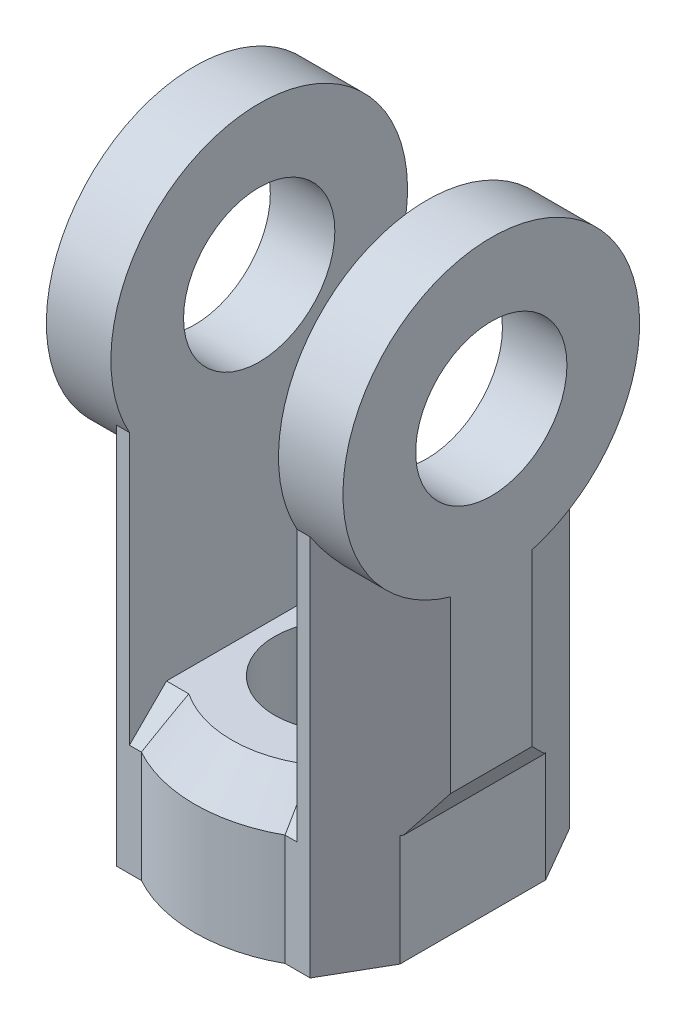
ISO-10303-21;
HEADER;
FILE_DESCRIPTION(('STEP AP214'),'2;1');
FILE_NAME('part.step','',(''),(''),'','','');
FILE_SCHEMA(('AUTOMOTIVE_DESIGN { 1 0 10303 214 1 1 1 1 }'));
ENDSEC;
DATA;
#1=APPLICATION_CONTEXT('core data for automotive mechanical design processes');
#2=APPLICATION_PROTOCOL_DEFINITION('international standard','automotive_design',2000,#1);
#3=PRODUCT_CONTEXT('',#1,'mechanical');
#4=PRODUCT('Part','Part','',(#3));
#5=PRODUCT_RELATED_PRODUCT_CATEGORY('part','',(#4));
#6=PRODUCT_DEFINITION_FORMATION('','',#4);
#7=PRODUCT_DEFINITION_CONTEXT('part definition',#1,'design');
#8=PRODUCT_DEFINITION('design','',#6,#7);
#9=PRODUCT_DEFINITION_SHAPE('','',#8);
#10=(LENGTH_UNIT() NAMED_UNIT(*) SI_UNIT(.MILLI.,.METRE.));
#11=(NAMED_UNIT(*) PLANE_ANGLE_UNIT() SI_UNIT($,.RADIAN.));
#12=(NAMED_UNIT(*) SI_UNIT($,.STERADIAN.) SOLID_ANGLE_UNIT());
#13=UNCERTAINTY_MEASURE_WITH_UNIT(LENGTH_MEASURE(1.E-05),#10,'distance_accuracy_value','');
#14=(GEOMETRIC_REPRESENTATION_CONTEXT(3) GLOBAL_UNCERTAINTY_ASSIGNED_CONTEXT((#13)) GLOBAL_UNIT_ASSIGNED_CONTEXT((#10,
#11,#12)) REPRESENTATION_CONTEXT('',''));
#15=CARTESIAN_POINT('',(0.,0.,0.));
#16=DIRECTION('',(0.,0.,1.));
#17=DIRECTION('',(1.,0.,0.));
#18=AXIS2_PLACEMENT_3D('',#15,#16,#17);
#19=CARTESIAN_POINT('',(-12.2967221242085,25.4,-22.225));
#20=DIRECTION('',(0.,0.,1.));
#21=DIRECTION('',(1.,0.,0.));
#22=AXIS2_PLACEMENT_3D('',#19,#20,#21);
#23=PLANE('',#22);
#24=DIRECTION('',(-1.,0.,0.));
#25=VECTOR('',#24,1.);
#26=CARTESIAN_POINT('',(57.4910489685532,65.4272778757914,-22.225));
#27=LINE('',#26,#25);
#28=CARTESIAN_POINT('',(-14.351,65.4272778757915,-22.225));
#29=VERTEX_POINT('',#28);
#30=CARTESIAN_POINT('',(-16.6011818975501,65.4272778757915,-22.225));
#31=VERTEX_POINT('',#30);
#32=EDGE_CURVE('E210',#29,#31,#27,.T.);
#33=ORIENTED_EDGE('',*,*,#32,.F.);
#34=DIRECTION('',(0.,-1.,0.));
#35=VECTOR('',#34,1.);
#36=CARTESIAN_POINT('',(-14.351,77.724,-22.225));
#37=LINE('',#36,#35);
#38=CARTESIAN_POINT('',(-14.351,19.0499999999999,-22.225));
#39=VERTEX_POINT('',#38);
#40=EDGE_CURVE('E221',#29,#39,#37,.T.);
#41=ORIENTED_EDGE('',*,*,#40,.T.);
#42=DIRECTION('',(1.,0.,0.));
#43=VECTOR('',#42,1.);
#44=CARTESIAN_POINT('',(-12.2967221242085,19.0499999999999,-22.225));
#45=LINE('',#44,#43);
#46=CARTESIAN_POINT('',(-12.2967221242085,19.0499999999999,-22.225));
#47=VERTEX_POINT('',#46);
#48=EDGE_CURVE('E280',#39,#47,#45,.T.);
#49=ORIENTED_EDGE('',*,*,#48,.T.);
#50=DIRECTION('',(0.,-1.,0.));
#51=VECTOR('',#50,1.);
#52=CARTESIAN_POINT('',(-12.2967221242085,25.4,-22.225));
#53=LINE('',#52,#51);
#54=CARTESIAN_POINT('',(-12.2967221242085,0.,-22.225));
#55=VERTEX_POINT('',#54);
#56=EDGE_CURVE('E264',#47,#55,#53,.T.);
#57=ORIENTED_EDGE('',*,*,#56,.T.);
#58=DIRECTION('',(-1.,0.,0.));
#59=VECTOR('',#58,1.);
#60=CARTESIAN_POINT('',(-12.2967221242085,0.,-22.225));
#61=LINE('',#60,#59);
#62=CARTESIAN_POINT('',(-16.6011818975501,0.,-22.225));
#63=VERTEX_POINT('',#62);
#64=EDGE_CURVE('E244',#55,#63,#61,.T.);
#65=ORIENTED_EDGE('',*,*,#64,.T.);
#66=DIRECTION('',(0.,1.,0.));
#67=VECTOR('',#66,1.);
#68=CARTESIAN_POINT('',(-16.6011818975501,25.4,-22.225));
#69=LINE('',#68,#67);
#70=EDGE_CURVE('E225',#63,#31,#69,.T.);
#71=ORIENTED_EDGE('',*,*,#70,.T.);
#72=EDGE_LOOP('',(#33,#41,#49,#57,#65,#71));
#73=FACE_BOUND('',#72,.T.);
#74=ADVANCED_FACE('F36',(#73),#23,.F.);
#75=CARTESIAN_POINT('',(-25.4,25.4,22.225));
#76=DIRECTION('',(0.,0.,-1.));
#77=DIRECTION('',(-1.,0.,0.));
#78=AXIS2_PLACEMENT_3D('',#75,#76,#77);
#79=PLANE('',#78);
#80=DIRECTION('',(-1.,0.,0.));
#81=VECTOR('',#80,1.);
#82=CARTESIAN_POINT('',(57.4910489685532,65.4272778757914,22.225));
#83=LINE('',#82,#81);
#84=CARTESIAN_POINT('',(-16.6011818975501,65.4272778757914,22.225));
#85=VERTEX_POINT('',#84);
#86=CARTESIAN_POINT('',(-14.351,65.4272778757914,22.225));
#87=VERTEX_POINT('',#86);
#88=EDGE_CURVE('E213',#85,#87,#83,.F.);
#89=ORIENTED_EDGE('',*,*,#88,.F.);
#90=DIRECTION('',(0.,-1.,0.));
#91=VECTOR('',#90,1.);
#92=CARTESIAN_POINT('',(-16.6011818975501,25.4,22.225));
#93=LINE('',#92,#91);
#94=CARTESIAN_POINT('',(-16.6011818975501,0.,22.225));
#95=VERTEX_POINT('',#94);
#96=EDGE_CURVE('E469',#85,#95,#93,.T.);
#97=ORIENTED_EDGE('',*,*,#96,.T.);
#98=DIRECTION('',(1.,0.,0.));
#99=VECTOR('',#98,1.);
#100=CARTESIAN_POINT('',(-25.4,0.,22.225));
#101=LINE('',#100,#99);
#102=CARTESIAN_POINT('',(-12.2967221242085,0.,22.225));
#103=VERTEX_POINT('',#102);
#104=EDGE_CURVE('E246',#95,#103,#101,.T.);
#105=ORIENTED_EDGE('',*,*,#104,.T.);
#106=DIRECTION('',(0.,-1.,0.));
#107=VECTOR('',#106,1.);
#108=CARTESIAN_POINT('',(-12.2967221242085,25.4,22.225));
#109=LINE('',#108,#107);
#110=CARTESIAN_POINT('',(-12.2967221242085,19.0499999999999,22.225));
#111=VERTEX_POINT('',#110);
#112=EDGE_CURVE('E261',#111,#103,#109,.T.);
#113=ORIENTED_EDGE('',*,*,#112,.F.);
#114=DIRECTION('',(-1.,0.,0.));
#115=VECTOR('',#114,1.);
#116=CARTESIAN_POINT('',(-14.351,19.0499999999999,22.225));
#117=LINE('',#116,#115);
#118=CARTESIAN_POINT('',(-14.351,19.0499999999999,22.225));
#119=VERTEX_POINT('',#118);
#120=EDGE_CURVE('E289',#111,#119,#117,.T.);
#121=ORIENTED_EDGE('',*,*,#120,.T.);
#122=DIRECTION('',(0.,-1.,0.));
#123=VECTOR('',#122,1.);
#124=CARTESIAN_POINT('',(-14.351,77.724,22.225));
#125=LINE('',#124,#123);
#126=EDGE_CURVE('E233',#87,#119,#125,.T.);
#127=ORIENTED_EDGE('',*,*,#126,.F.);
#128=EDGE_LOOP('',(#89,#97,#105,#113,#121,#127));
#129=FACE_BOUND('',#128,.T.);
#130=ADVANCED_FACE('F392',(#129),#79,.F.);
#131=CARTESIAN_POINT('',(25.4,25.4,-22.225));
#132=DIRECTION('',(-1.,0.,0.));
#133=DIRECTION('',(0.,0.,1.));
#134=AXIS2_PLACEMENT_3D('',#131,#132,#133);
#135=PLANE('',#134);
#136=CARTESIAN_POINT('',(25.4,77.724,0.));
#137=DIRECTION('',(1.,0.,0.));
#138=DIRECTION('',(0.,0.,-1.));
#139=AXIS2_PLACEMENT_3D('',#136,#137,#138);
#140=CIRCLE('',#139,12.954);
#141=CARTESIAN_POINT('',(25.4,77.724,-12.954));
#142=VERTEX_POINT('',#141);
#143=EDGE_CURVE('E597',#142,#142,#140,.T.);
#144=ORIENTED_EDGE('',*,*,#143,.F.);
#145=EDGE_LOOP('',(#144));
#146=FACE_BOUND('',#145,.T.);
#147=DIRECTION('',(0.,-1.,0.));
#148=VECTOR('',#147,1.);
#149=CARTESIAN_POINT('',(25.4,25.4,6.98499999999993));
#150=LINE('',#149,#148);
#151=CARTESIAN_POINT('',(25.4,53.3033166557526,6.98499999999993));
#152=VERTEX_POINT('',#151);
#153=CARTESIAN_POINT('',(25.4,24.13,6.98499999999993));
#154=VERTEX_POINT('',#153);
#155=EDGE_CURVE('E621',#152,#154,#150,.T.);
#156=ORIENTED_EDGE('',*,*,#155,.T.);
#157=DIRECTION('',(0.,0.,-1.));
#158=VECTOR('',#157,1.);
#159=CARTESIAN_POINT('',(25.4,24.13,-6.98499999999991));
#160=LINE('',#159,#158);
#161=CARTESIAN_POINT('',(25.4,24.13,-6.98499999999991));
#162=VERTEX_POINT('',#161);
#163=EDGE_CURVE('E44',#154,#162,#160,.T.);
#164=ORIENTED_EDGE('',*,*,#163,.T.);
#165=DIRECTION('',(0.,1.,0.));
#166=VECTOR('',#165,1.);
#167=CARTESIAN_POINT('',(25.4,25.4,-6.98499999999991));
#168=LINE('',#167,#166);
#169=CARTESIAN_POINT('',(25.4,53.3033166557526,-6.98499999999991));
#170=VERTEX_POINT('',#169);
#171=EDGE_CURVE('E302',#162,#170,#168,.T.);
#172=ORIENTED_EDGE('',*,*,#171,.T.);
#173=CARTESIAN_POINT('',(25.4,77.724,0.));
#174=DIRECTION('',(1.,0.,0.));
#175=DIRECTION('',(0.,0.,-1.));
#176=AXIS2_PLACEMENT_3D('',#173,#174,#175);
#177=CIRCLE('',#176,25.4);
#178=EDGE_CURVE('E226',#170,#152,#177,.T.);
#179=ORIENTED_EDGE('',*,*,#178,.T.);
#180=EDGE_LOOP('',(#156,#164,#172,#179));
#181=FACE_BOUND('',#180,.T.);
#182=ADVANCED_FACE('F397',(#146,#181),#135,.F.);
#183=CARTESIAN_POINT('',(0.,25.4,0.));
#184=DIRECTION('',(0.,1.,0.));
#185=DIRECTION('',(0.,0.,1.));
#186=AXIS2_PLACEMENT_3D('',#183,#184,#185);
#187=PLANE('',#186);
#188=CARTESIAN_POINT('',(0.,25.4,0.));
#189=DIRECTION('',(0.,1.,0.));
#190=DIRECTION('',(0.,0.,1.));
#191=AXIS2_PLACEMENT_3D('',#188,#189,#190);
#192=CIRCLE('',#191,11.70813);
#193=CARTESIAN_POINT('',(0.,25.4,11.70813));
#194=VERTEX_POINT('',#193);
#195=EDGE_CURVE('E350',#194,#194,#192,.T.);
#196=ORIENTED_EDGE('',*,*,#195,.F.);
#197=EDGE_LOOP('',(#196));
#198=FACE_BOUND('',#197,.T.);
#199=CARTESIAN_POINT('',(0.,25.4,0.));
#200=DIRECTION('',(0.,1.,0.));
#201=DIRECTION('',(0.,0.,1.));
#202=AXIS2_PLACEMENT_3D('',#199,#200,#201);
#203=CIRCLE('',#202,19.05);
#204=CARTESIAN_POINT('',(10.5302837093784,25.4,-15.875));
#205=VERTEX_POINT('',#204);
#206=CARTESIAN_POINT('',(-10.5302837093784,25.4,-15.875));
#207=VERTEX_POINT('',#206);
#208=EDGE_CURVE('E273',#205,#207,#203,.T.);
#209=ORIENTED_EDGE('',*,*,#208,.T.);
#210=DIRECTION('',(-1.,0.,0.));
#211=VECTOR('',#210,1.);
#212=CARTESIAN_POINT('',(-14.351,25.4,-15.875));
#213=LINE('',#212,#211);
#214=CARTESIAN_POINT('',(-14.351,25.4,-15.875));
#215=VERTEX_POINT('',#214);
#216=EDGE_CURVE('E277',#207,#215,#213,.T.);
#217=ORIENTED_EDGE('',*,*,#216,.T.);
#218=DIRECTION('',(0.,0.,-1.));
#219=VECTOR('',#218,1.);
#220=CARTESIAN_POINT('',(-14.351,25.4,-22.225));
#221=LINE('',#220,#219);
#222=CARTESIAN_POINT('',(-14.351,25.4,15.875));
#223=VERTEX_POINT('',#222);
#224=EDGE_CURVE('E234',#223,#215,#221,.T.);
#225=ORIENTED_EDGE('',*,*,#224,.F.);
#226=DIRECTION('',(1.,0.,0.));
#227=VECTOR('',#226,1.);
#228=CARTESIAN_POINT('',(-12.2967221242085,25.4,15.875));
#229=LINE('',#228,#227);
#230=CARTESIAN_POINT('',(-10.5302837093784,25.4,15.875));
#231=VERTEX_POINT('',#230);
#232=EDGE_CURVE('E268',#223,#231,#229,.T.);
#233=ORIENTED_EDGE('',*,*,#232,.T.);
#234=CARTESIAN_POINT('',(0.,25.4,0.));
#235=DIRECTION('',(0.,1.,0.));
#236=DIRECTION('',(0.,0.,1.));
#237=AXIS2_PLACEMENT_3D('',#234,#235,#236);
#238=CIRCLE('',#237,19.05);
#239=CARTESIAN_POINT('',(10.5302837093784,25.4,15.875));
#240=VERTEX_POINT('',#239);
#241=EDGE_CURVE('E266',#231,#240,#238,.T.);
#242=ORIENTED_EDGE('',*,*,#241,.T.);
#243=DIRECTION('',(1.,0.,0.));
#244=VECTOR('',#243,1.);
#245=CARTESIAN_POINT('',(14.351,25.4,15.875));
#246=LINE('',#245,#244);
#247=CARTESIAN_POINT('',(14.351,25.4,15.875));
#248=VERTEX_POINT('',#247);
#249=EDGE_CURVE('E270',#240,#248,#246,.T.);
#250=ORIENTED_EDGE('',*,*,#249,.T.);
#251=DIRECTION('',(0.,0.,1.));
#252=VECTOR('',#251,1.);
#253=CARTESIAN_POINT('',(14.351,25.4,22.225));
#254=LINE('',#253,#252);
#255=CARTESIAN_POINT('',(14.351,25.4,-15.875));
#256=VERTEX_POINT('',#255);
#257=EDGE_CURVE('E443',#256,#248,#254,.T.);
#258=ORIENTED_EDGE('',*,*,#257,.F.);
#259=DIRECTION('',(-1.,0.,0.));
#260=VECTOR('',#259,1.);
#261=CARTESIAN_POINT('',(12.2967221242085,25.4,-15.875));
#262=LINE('',#261,#260);
#263=EDGE_CURVE('E275',#256,#205,#262,.T.);
#264=ORIENTED_EDGE('',*,*,#263,.T.);
#265=EDGE_LOOP('',(#209,#217,#225,#233,#242,#250,#258,#264));
#266=FACE_BOUND('',#265,.T.);
#267=ADVANCED_FACE('F404',(#198,#266),#187,.T.);
#268=CARTESIAN_POINT('',(0.,25.4,0.));
#269=DIRECTION('',(0.,-1.,0.));
#270=DIRECTION('',(0.,0.,-1.));
#271=AXIS2_PLACEMENT_3D('',#268,#269,#270);
#272=CYLINDRICAL_SURFACE('',#271,25.4);
#273=ORIENTED_EDGE('',*,*,#56,.F.);
#274=CARTESIAN_POINT('',(0.,19.0499999999999,0.));
#275=DIRECTION('',(0.,1.,0.));
#276=DIRECTION('',(0.,0.,1.));
#277=AXIS2_PLACEMENT_3D('',#274,#275,#276);
#278=CIRCLE('',#277,25.4);
#279=CARTESIAN_POINT('',(12.2967221242085,19.0499999999999,-22.225));
#280=VERTEX_POINT('',#279);
#281=EDGE_CURVE('E285',#47,#280,#278,.F.);
#282=ORIENTED_EDGE('',*,*,#281,.T.);
#283=DIRECTION('',(0.,-1.,0.));
#284=VECTOR('',#283,1.);
#285=CARTESIAN_POINT('',(12.2967221242085,25.4,-22.225));
#286=LINE('',#285,#284);
#287=CARTESIAN_POINT('',(12.2967221242085,0.,-22.225));
#288=VERTEX_POINT('',#287);
#289=EDGE_CURVE('E256',#280,#288,#286,.T.);
#290=ORIENTED_EDGE('',*,*,#289,.T.);
#291=CARTESIAN_POINT('',(0.,0.,0.));
#292=DIRECTION('',(0.,1.,0.));
#293=DIRECTION('',(0.,0.,1.));
#294=AXIS2_PLACEMENT_3D('',#291,#292,#293);
#295=CIRCLE('',#294,25.4);
#296=EDGE_CURVE('E236',#288,#55,#295,.T.);
#297=ORIENTED_EDGE('',*,*,#296,.T.);
#298=EDGE_LOOP('',(#273,#282,#290,#297));
#299=FACE_BOUND('',#298,.T.);
#300=ADVANCED_FACE('F402',(#299),#272,.T.);
#301=CARTESIAN_POINT('',(-25.4,25.4,-22.225));
#302=DIRECTION('',(1.,0.,0.));
#303=DIRECTION('',(0.,0.,-1.));
#304=AXIS2_PLACEMENT_3D('',#301,#302,#303);
#305=PLANE('',#304);
#306=CARTESIAN_POINT('',(-25.4,77.724,0.));
#307=DIRECTION('',(1.,0.,0.));
#308=DIRECTION('',(0.,0.,-1.));
#309=AXIS2_PLACEMENT_3D('',#306,#307,#308);
#310=CIRCLE('',#309,12.954);
#311=CARTESIAN_POINT('',(-25.4,77.724,-12.954));
#312=VERTEX_POINT('',#311);
#313=EDGE_CURVE('E498',#312,#312,#310,.T.);
#314=ORIENTED_EDGE('',*,*,#313,.T.);
#315=EDGE_LOOP('',(#314));
#316=FACE_BOUND('',#315,.T.);
#317=DIRECTION('',(0.,-1.,0.));
#318=VECTOR('',#317,1.);
#319=CARTESIAN_POINT('',(-25.4,25.4,-6.98499999999992));
#320=LINE('',#319,#318);
#321=CARTESIAN_POINT('',(-25.4,53.3033166557526,-6.98499999999989));
#322=VERTEX_POINT('',#321);
#323=CARTESIAN_POINT('',(-25.4,24.13,-6.98499999999992));
#324=VERTEX_POINT('',#323);
#325=EDGE_CURVE('E467',#322,#324,#320,.T.);
#326=ORIENTED_EDGE('',*,*,#325,.T.);
#327=DIRECTION('',(0.,0.,1.));
#328=VECTOR('',#327,1.);
#329=CARTESIAN_POINT('',(-25.4,24.13,-22.225));
#330=LINE('',#329,#328);
#331=CARTESIAN_POINT('',(-25.4,24.13,6.98499999999992));
#332=VERTEX_POINT('',#331);
#333=EDGE_CURVE('E493',#324,#332,#330,.T.);
#334=ORIENTED_EDGE('',*,*,#333,.T.);
#335=DIRECTION('',(0.,1.,0.));
#336=VECTOR('',#335,1.);
#337=CARTESIAN_POINT('',(-25.4,25.4,6.98499999999992));
#338=LINE('',#337,#336);
#339=CARTESIAN_POINT('',(-25.4,53.3033166557526,6.98499999999992));
#340=VERTEX_POINT('',#339);
#341=EDGE_CURVE('E472',#332,#340,#338,.T.);
#342=ORIENTED_EDGE('',*,*,#341,.T.);
#343=CARTESIAN_POINT('',(-25.4,77.724,0.));
#344=DIRECTION('',(1.,0.,0.));
#345=DIRECTION('',(0.,0.,-1.));
#346=AXIS2_PLACEMENT_3D('',#343,#344,#345);
#347=CIRCLE('',#346,25.4);
#348=EDGE_CURVE('E217',#322,#340,#347,.T.);
#349=ORIENTED_EDGE('',*,*,#348,.F.);
#350=EDGE_LOOP('',(#326,#334,#342,#349));
#351=FACE_BOUND('',#350,.T.);
#352=ADVANCED_FACE('F401',(#316,#351),#305,.F.);
#353=CARTESIAN_POINT('',(0.,25.4,0.));
#354=DIRECTION('',(0.,-1.,0.));
#355=DIRECTION('',(0.,0.,-1.));
#356=AXIS2_PLACEMENT_3D('',#353,#354,#355);
#357=CYLINDRICAL_SURFACE('',#356,25.4);
#358=DIRECTION('',(0.,-1.,0.));
#359=VECTOR('',#358,1.);
#360=CARTESIAN_POINT('',(12.2967221242085,25.4,22.225));
#361=LINE('',#360,#359);
#362=CARTESIAN_POINT('',(12.2967221242085,19.0499999999999,22.225));
#363=VERTEX_POINT('',#362);
#364=CARTESIAN_POINT('',(12.2967221242085,0.,22.225));
#365=VERTEX_POINT('',#364);
#366=EDGE_CURVE('E259',#363,#365,#361,.T.);
#367=ORIENTED_EDGE('',*,*,#366,.F.);
#368=CARTESIAN_POINT('',(0.,19.0499999999999,0.));
#369=DIRECTION('',(0.,1.,0.));
#370=DIRECTION('',(0.,0.,1.));
#371=AXIS2_PLACEMENT_3D('',#368,#369,#370);
#372=CIRCLE('',#371,25.4);
#373=EDGE_CURVE('E292',#363,#111,#372,.F.);
#374=ORIENTED_EDGE('',*,*,#373,.T.);
#375=ORIENTED_EDGE('',*,*,#112,.T.);
#376=CARTESIAN_POINT('',(0.,0.,0.));
#377=DIRECTION('',(0.,1.,0.));
#378=DIRECTION('',(0.,0.,1.));
#379=AXIS2_PLACEMENT_3D('',#376,#377,#378);
#380=CIRCLE('',#379,25.4);
#381=EDGE_CURVE('E248',#103,#365,#380,.T.);
#382=ORIENTED_EDGE('',*,*,#381,.T.);
#383=EDGE_LOOP('',(#367,#374,#375,#382));
#384=FACE_BOUND('',#383,.T.);
#385=ADVANCED_FACE('F410',(#384),#357,.T.);
#386=CARTESIAN_POINT('',(25.4,25.4,22.225));
#387=DIRECTION('',(0.,0.,-1.));
#388=DIRECTION('',(-1.,0.,0.));
#389=AXIS2_PLACEMENT_3D('',#386,#387,#388);
#390=PLANE('',#389);
#391=DIRECTION('',(0.,1.,0.));
#392=VECTOR('',#391,1.);
#393=CARTESIAN_POINT('',(16.6011818975501,25.4,22.225));
#394=LINE('',#393,#392);
#395=CARTESIAN_POINT('',(16.6011818975501,0.,22.225));
#396=VERTEX_POINT('',#395);
#397=CARTESIAN_POINT('',(16.6011818975501,65.4272778757914,22.225));
#398=VERTEX_POINT('',#397);
#399=EDGE_CURVE('E579',#396,#398,#394,.T.);
#400=ORIENTED_EDGE('',*,*,#399,.T.);
#401=DIRECTION('',(1.,0.,0.));
#402=VECTOR('',#401,1.);
#403=CARTESIAN_POINT('',(-57.4910489685532,65.4272778757915,22.225));
#404=LINE('',#403,#402);
#405=CARTESIAN_POINT('',(14.351,65.4272778757914,22.225));
#406=VERTEX_POINT('',#405);
#407=EDGE_CURVE('E578',#398,#406,#404,.F.);
#408=ORIENTED_EDGE('',*,*,#407,.T.);
#409=DIRECTION('',(0.,-1.,0.));
#410=VECTOR('',#409,1.);
#411=CARTESIAN_POINT('',(14.351,77.724,22.225));
#412=LINE('',#411,#410);
#413=CARTESIAN_POINT('',(14.351,19.0499999999999,22.225));
#414=VERTEX_POINT('',#413);
#415=EDGE_CURVE('E442',#406,#414,#412,.T.);
#416=ORIENTED_EDGE('',*,*,#415,.T.);
#417=DIRECTION('',(-1.,0.,0.));
#418=VECTOR('',#417,1.);
#419=CARTESIAN_POINT('',(12.2967221242085,19.0499999999999,22.225));
#420=LINE('',#419,#418);
#421=EDGE_CURVE('E287',#414,#363,#420,.T.);
#422=ORIENTED_EDGE('',*,*,#421,.T.);
#423=ORIENTED_EDGE('',*,*,#366,.T.);
#424=DIRECTION('',(1.,0.,0.));
#425=VECTOR('',#424,1.);
#426=CARTESIAN_POINT('',(25.4,0.,22.225));
#427=LINE('',#426,#425);
#428=EDGE_CURVE('E251',#365,#396,#427,.T.);
#429=ORIENTED_EDGE('',*,*,#428,.T.);
#430=EDGE_LOOP('',(#400,#408,#416,#422,#423,#429));
#431=FACE_BOUND('',#430,.T.);
#432=ADVANCED_FACE('F560',(#431),#390,.F.);
#433=CARTESIAN_POINT('',(12.2967221242085,25.4,-22.225));
#434=DIRECTION('',(0.,0.,1.));
#435=DIRECTION('',(1.,0.,0.));
#436=AXIS2_PLACEMENT_3D('',#433,#434,#435);
#437=PLANE('',#436);
#438=DIRECTION('',(0.,-1.,0.));
#439=VECTOR('',#438,1.);
#440=CARTESIAN_POINT('',(14.351,77.724,-22.225));
#441=LINE('',#440,#439);
#442=CARTESIAN_POINT('',(14.351,65.4272778757915,-22.225));
#443=VERTEX_POINT('',#442);
#444=CARTESIAN_POINT('',(14.351,19.0499999999999,-22.225));
#445=VERTEX_POINT('',#444);
#446=EDGE_CURVE('E238',#443,#445,#441,.T.);
#447=ORIENTED_EDGE('',*,*,#446,.F.);
#448=DIRECTION('',(1.,0.,0.));
#449=VECTOR('',#448,1.);
#450=CARTESIAN_POINT('',(-57.4910489685532,65.4272778757914,-22.225));
#451=LINE('',#450,#449);
#452=CARTESIAN_POINT('',(16.6011818975501,65.4272778757915,-22.225));
#453=VERTEX_POINT('',#452);
#454=EDGE_CURVE('E584',#443,#453,#451,.T.);
#455=ORIENTED_EDGE('',*,*,#454,.T.);
#456=DIRECTION('',(0.,-1.,0.));
#457=VECTOR('',#456,1.);
#458=CARTESIAN_POINT('',(16.6011818975501,25.4,-22.225));
#459=LINE('',#458,#457);
#460=CARTESIAN_POINT('',(16.6011818975501,0.,-22.225));
#461=VERTEX_POINT('',#460);
#462=EDGE_CURVE('E466',#453,#461,#459,.T.);
#463=ORIENTED_EDGE('',*,*,#462,.T.);
#464=DIRECTION('',(-1.,0.,0.));
#465=VECTOR('',#464,1.);
#466=CARTESIAN_POINT('',(12.2967221242085,0.,-22.225));
#467=LINE('',#466,#465);
#468=EDGE_CURVE('E254',#461,#288,#467,.T.);
#469=ORIENTED_EDGE('',*,*,#468,.T.);
#470=ORIENTED_EDGE('',*,*,#289,.F.);
#471=DIRECTION('',(1.,0.,0.));
#472=VECTOR('',#471,1.);
#473=CARTESIAN_POINT('',(14.351,19.0499999999999,-22.225));
#474=LINE('',#473,#472);
#475=EDGE_CURVE('E282',#280,#445,#474,.T.);
#476=ORIENTED_EDGE('',*,*,#475,.T.);
#477=EDGE_LOOP('',(#447,#455,#463,#469,#470,#476));
#478=FACE_BOUND('',#477,.T.);
#479=ADVANCED_FACE('F455',(#478),#437,.F.);
#480=CARTESIAN_POINT('',(0.,0.,0.));
#481=DIRECTION('',(0.,1.,0.));
#482=DIRECTION('',(0.,0.,1.));
#483=AXIS2_PLACEMENT_3D('',#480,#481,#482);
#484=PLANE('',#483);
#485=CARTESIAN_POINT('',(0.,0.,0.));
#486=DIRECTION('',(0.,-1.,0.));
#487=DIRECTION('',(0.,0.,-1.));
#488=AXIS2_PLACEMENT_3D('',#485,#486,#487);
#489=CIRCLE('',#488,11.70813);
#490=CARTESIAN_POINT('',(0.,0.,-11.70813));
#491=VERTEX_POINT('',#490);
#492=EDGE_CURVE('E535',#491,#491,#489,.T.);
#493=ORIENTED_EDGE('',*,*,#492,.F.);
#494=EDGE_LOOP('',(#493));
#495=FACE_BOUND('',#494,.T.);
#496=DIRECTION('',(-0.499999999999998,0.,-0.86602540378444));
#497=VECTOR('',#496,1.);
#498=CARTESIAN_POINT('',(16.6011818975501,0.,-22.225));
#499=LINE('',#498,#497);
#500=CARTESIAN_POINT('',(22.225,0.,-12.4842613140311));
#501=VERTEX_POINT('',#500);
#502=EDGE_CURVE('E620',#461,#501,#499,.F.);
#503=ORIENTED_EDGE('',*,*,#502,.T.);
#504=DIRECTION('',(0.,0.,-1.));
#505=VECTOR('',#504,1.);
#506=CARTESIAN_POINT('',(22.225,0.,20.8076434326934));
#507=LINE('',#506,#505);
#508=CARTESIAN_POINT('',(22.225,0.,12.4842613140311));
#509=VERTEX_POINT('',#508);
#510=EDGE_CURVE('E525',#509,#501,#507,.T.);
#511=ORIENTED_EDGE('',*,*,#510,.F.);
#512=DIRECTION('',(0.499999999999998,0.,-0.86602540378444));
#513=VECTOR('',#512,1.);
#514=CARTESIAN_POINT('',(25.4,0.,6.98499999999993));
#515=LINE('',#514,#513);
#516=EDGE_CURVE('E626',#509,#396,#515,.F.);
#517=ORIENTED_EDGE('',*,*,#516,.T.);
#518=ORIENTED_EDGE('',*,*,#428,.F.);
#519=ORIENTED_EDGE('',*,*,#381,.F.);
#520=ORIENTED_EDGE('',*,*,#104,.F.);
#521=DIRECTION('',(0.499999999999998,0.,0.86602540378444));
#522=VECTOR('',#521,1.);
#523=CARTESIAN_POINT('',(-16.6011818975501,0.,22.225));
#524=LINE('',#523,#522);
#525=CARTESIAN_POINT('',(-22.225,0.,12.4842613140311));
#526=VERTEX_POINT('',#525);
#527=EDGE_CURVE('E618',#95,#526,#524,.F.);
#528=ORIENTED_EDGE('',*,*,#527,.T.);
#529=DIRECTION('',(0.,0.,1.));
#530=VECTOR('',#529,1.);
#531=CARTESIAN_POINT('',(-22.225,0.,20.8076434326934));
#532=LINE('',#531,#530);
#533=CARTESIAN_POINT('',(-22.225,0.,-12.4842613140311));
#534=VERTEX_POINT('',#533);
#535=EDGE_CURVE('E523',#534,#526,#532,.T.);
#536=ORIENTED_EDGE('',*,*,#535,.F.);
#537=DIRECTION('',(-0.499999999999997,0.,0.86602540378444));
#538=VECTOR('',#537,1.);
#539=CARTESIAN_POINT('',(-25.4,0.,-6.98499999999992));
#540=LINE('',#539,#538);
#541=EDGE_CURVE('E462',#534,#63,#540,.F.);
#542=ORIENTED_EDGE('',*,*,#541,.T.);
#543=ORIENTED_EDGE('',*,*,#64,.F.);
#544=ORIENTED_EDGE('',*,*,#296,.F.);
#545=ORIENTED_EDGE('',*,*,#468,.F.);
#546=EDGE_LOOP('',(#503,#511,#517,#518,#519,#520,#528,#536,#542,#543,#544,#545));
#547=FACE_BOUND('',#546,.T.);
#548=ADVANCED_FACE('F459',(#495,#547),#484,.F.);
#549=CARTESIAN_POINT('',(-14.351,77.724,-22.225));
#550=DIRECTION('',(-1.,0.,0.));
#551=DIRECTION('',(0.,0.,1.));
#552=AXIS2_PLACEMENT_3D('',#549,#550,#551);
#553=PLANE('',#552);
#554=CARTESIAN_POINT('',(-14.351,77.724,0.));
#555=DIRECTION('',(-1.,0.,0.));
#556=DIRECTION('',(0.,0.,1.));
#557=AXIS2_PLACEMENT_3D('',#554,#555,#556);
#558=CIRCLE('',#557,12.954);
#559=CARTESIAN_POINT('',(-14.351,77.724,12.954));
#560=VERTEX_POINT('',#559);
#561=EDGE_CURVE('E497',#560,#560,#558,.T.);
#562=ORIENTED_EDGE('',*,*,#561,.T.);
#563=EDGE_LOOP('',(#562));
#564=FACE_BOUND('',#563,.T.);
#565=ORIENTED_EDGE('',*,*,#40,.F.);
#566=CARTESIAN_POINT('',(-14.351,77.724,0.));
#567=DIRECTION('',(-1.,0.,0.));
#568=DIRECTION('',(0.,0.,1.));
#569=AXIS2_PLACEMENT_3D('',#566,#567,#568);
#570=CIRCLE('',#569,25.4);
#571=EDGE_CURVE('E207',#87,#29,#570,.T.);
#572=ORIENTED_EDGE('',*,*,#571,.F.);
#573=ORIENTED_EDGE('',*,*,#126,.T.);
#574=DIRECTION('',(0.,0.70710678118655,-0.707106781186545));
#575=VECTOR('',#574,1.);
#576=CARTESIAN_POINT('',(-14.351,70.6120000000002,-29.3369999999999));
#577=LINE('',#576,#575);
#578=EDGE_CURVE('E300',#119,#223,#577,.T.);
#579=ORIENTED_EDGE('',*,*,#578,.T.);
#580=ORIENTED_EDGE('',*,*,#224,.T.);
#581=DIRECTION('',(0.,-0.70710678118655,-0.707106781186545));
#582=VECTOR('',#581,1.);
#583=CARTESIAN_POINT('',(-14.351,48.3870000000001,7.11200000000004));
#584=LINE('',#583,#582);
#585=EDGE_CURVE('E231',#215,#39,#584,.T.);
#586=ORIENTED_EDGE('',*,*,#585,.T.);
#587=EDGE_LOOP('',(#565,#572,#573,#579,#580,#586));
#588=FACE_BOUND('',#587,.T.);
#589=ADVANCED_FACE('F229',(#564,#588),#553,.F.);
#590=CARTESIAN_POINT('',(14.351,77.724,22.225));
#591=DIRECTION('',(1.,0.,0.));
#592=DIRECTION('',(0.,0.,-1.));
#593=AXIS2_PLACEMENT_3D('',#590,#591,#592);
#594=PLANE('',#593);
#595=CARTESIAN_POINT('',(14.351,77.724,0.));
#596=DIRECTION('',(1.,0.,0.));
#597=DIRECTION('',(0.,0.,-1.));
#598=AXIS2_PLACEMENT_3D('',#595,#596,#597);
#599=CIRCLE('',#598,12.954);
#600=CARTESIAN_POINT('',(14.351,77.724,-12.954));
#601=VERTEX_POINT('',#600);
#602=EDGE_CURVE('E494',#601,#601,#599,.T.);
#603=ORIENTED_EDGE('',*,*,#602,.T.);
#604=EDGE_LOOP('',(#603));
#605=FACE_BOUND('',#604,.T.);
#606=ORIENTED_EDGE('',*,*,#415,.F.);
#607=CARTESIAN_POINT('',(14.351,77.724,0.));
#608=DIRECTION('',(1.,0.,0.));
#609=DIRECTION('',(0.,0.,-1.));
#610=AXIS2_PLACEMENT_3D('',#607,#608,#609);
#611=CIRCLE('',#610,25.4);
#612=EDGE_CURVE('E451',#406,#443,#611,.F.);
#613=ORIENTED_EDGE('',*,*,#612,.T.);
#614=ORIENTED_EDGE('',*,*,#446,.T.);
#615=DIRECTION('',(0.,0.70710678118655,0.707106781186545));
#616=VECTOR('',#615,1.);
#617=CARTESIAN_POINT('',(14.351,70.6120000000002,29.3369999999999));
#618=LINE('',#617,#616);
#619=EDGE_CURVE('E295',#445,#256,#618,.T.);
#620=ORIENTED_EDGE('',*,*,#619,.T.);
#621=ORIENTED_EDGE('',*,*,#257,.T.);
#622=DIRECTION('',(0.,-0.70710678118655,0.707106781186545));
#623=VECTOR('',#622,1.);
#624=CARTESIAN_POINT('',(14.351,48.3870000000001,-7.11200000000003));
#625=LINE('',#624,#623);
#626=EDGE_CURVE('E297',#248,#414,#625,.T.);
#627=ORIENTED_EDGE('',*,*,#626,.T.);
#628=EDGE_LOOP('',(#606,#613,#614,#620,#621,#627));
#629=FACE_BOUND('',#628,.T.);
#630=ADVANCED_FACE('F332',(#605,#629),#594,.F.);
#631=CARTESIAN_POINT('',(0.,25.4,-15.875));
#632=DIRECTION('',(0.,0.707106781186545,-0.70710678118655));
#633=DIRECTION('',(1.,0.,0.));
#634=AXIS2_PLACEMENT_3D('',#631,#632,#633);
#635=PLANE('',#634);
#636=ORIENTED_EDGE('',*,*,#619,.F.);
#637=ORIENTED_EDGE('',*,*,#475,.F.);
#638=CARTESIAN_POINT('',(10.5302837093784,25.4,-15.875));
#639=CARTESIAN_POINT('',(10.6893037061973,24.8725031457687,-16.4024968542313));
#640=CARTESIAN_POINT('',(10.8449270306173,24.3444989328304,-16.9305010671695));
#641=CARTESIAN_POINT('',(11.1500582884072,23.2876365632886,-17.9873634367113));
#642=CARTESIAN_POINT('',(11.2995665496581,22.7587784540545,-18.5162215459454));
#643=CARTESIAN_POINT('',(11.5931598758364,21.7003220824518,-19.5746779175482));
#644=CARTESIAN_POINT('',(11.7372450399774,21.1707238338077,-20.1042761661923));
#645=CARTESIAN_POINT('',(12.0205240213133,20.1108438214413,-21.1641561785586));
#646=CARTESIAN_POINT('',(12.1597175758387,19.5805620225941,-21.6944379774059));
#647=CARTESIAN_POINT('',(12.2967221242085,19.0499999999999,-22.225));
#648=B_SPLINE_CURVE_WITH_KNOTS('',3,(#638,#639,#640,#641,#642,#643,#644,#645,#646,#647),
.UNSPECIFIED.,.F.,.F.,(4,2,2,2,4),(0.,2.28824401361607,4.57636517356522,6.86444445280377,
9.15264641003087),.UNSPECIFIED.);
#649=EDGE_CURVE('E312',#205,#280,#648,.T.);
#650=ORIENTED_EDGE('',*,*,#649,.F.);
#651=ORIENTED_EDGE('',*,*,#263,.F.);
#652=EDGE_LOOP('',(#636,#637,#650,#651));
#653=FACE_BOUND('',#652,.T.);
#654=ADVANCED_FACE('F326',(#653),#635,.T.);
#655=CARTESIAN_POINT('',(0.,25.4,0.));
#656=DIRECTION('',(0.,-1.,0.));
#657=DIRECTION('',(0.,0.,-1.));
#658=AXIS2_PLACEMENT_3D('',#655,#656,#657);
#659=CONICAL_SURFACE('',#658,19.05,0.785398163397445);
#660=ORIENTED_EDGE('',*,*,#649,.T.);
#661=ORIENTED_EDGE('',*,*,#281,.F.);
#662=CARTESIAN_POINT('',(-12.2967221242085,19.0499999999999,-22.225));
#663=CARTESIAN_POINT('',(-12.1597175758387,19.5805620225941,-21.6944379774059));
#664=CARTESIAN_POINT('',(-12.0205240213133,20.1108438214413,-21.1641561785586));
#665=CARTESIAN_POINT('',(-11.7372450399774,21.1707238338077,-20.1042761661923));
#666=CARTESIAN_POINT('',(-11.5931598758364,21.7003220824518,-19.5746779175482));
#667=CARTESIAN_POINT('',(-11.2995665496581,22.7587784540545,-18.5162215459454));
#668=CARTESIAN_POINT('',(-11.1500582884072,23.2876365632886,-17.9873634367113));
#669=CARTESIAN_POINT('',(-10.8449270306173,24.3444989328304,-16.9305010671696));
#670=CARTESIAN_POINT('',(-10.6893037061973,24.8725031457687,-16.4024968542313));
#671=CARTESIAN_POINT('',(-10.5302837093784,25.4,-15.875));
#672=B_SPLINE_CURVE_WITH_KNOTS('',3,(#662,#663,#664,#665,#666,#667,#668,#669,#670,#671),
.UNSPECIFIED.,.F.,.F.,(4,2,2,2,4),(0.,2.28820195722709,4.57628123646565,6.8644023964148,
9.15264641003086),.UNSPECIFIED.);
#673=EDGE_CURVE('E303',#207,#47,#672,.F.);
#674=ORIENTED_EDGE('',*,*,#673,.F.);
#675=ORIENTED_EDGE('',*,*,#208,.F.);
#676=EDGE_LOOP('',(#660,#661,#674,#675));
#677=FACE_BOUND('',#676,.T.);
#678=ADVANCED_FACE('F323',(#677),#659,.T.);
#679=CARTESIAN_POINT('',(0.,25.4,-15.875));
#680=DIRECTION('',(0.,0.707106781186545,-0.70710678118655));
#681=DIRECTION('',(1.,0.,0.));
#682=AXIS2_PLACEMENT_3D('',#679,#680,#681);
#683=PLANE('',#682);
#684=ORIENTED_EDGE('',*,*,#673,.T.);
#685=ORIENTED_EDGE('',*,*,#48,.F.);
#686=ORIENTED_EDGE('',*,*,#585,.F.);
#687=ORIENTED_EDGE('',*,*,#216,.F.);
#688=EDGE_LOOP('',(#684,#685,#686,#687));
#689=FACE_BOUND('',#688,.T.);
#690=ADVANCED_FACE('F320',(#689),#683,.T.);
#691=CARTESIAN_POINT('',(0.,25.4,15.875));
#692=DIRECTION('',(0.,0.707106781186545,0.70710678118655));
#693=DIRECTION('',(-1.,0.,0.));
#694=AXIS2_PLACEMENT_3D('',#691,#692,#693);
#695=PLANE('',#694);
#696=ORIENTED_EDGE('',*,*,#578,.F.);
#697=ORIENTED_EDGE('',*,*,#120,.F.);
#698=CARTESIAN_POINT('',(-10.5302837093784,25.4,15.875));
#699=CARTESIAN_POINT('',(-10.6893037061972,24.8725031457687,16.4024968542313));
#700=CARTESIAN_POINT('',(-10.8449270306173,24.3444989328304,16.9305010671696));
#701=CARTESIAN_POINT('',(-11.1500582884072,23.2876365632886,17.9873634367114));
#702=CARTESIAN_POINT('',(-11.2995665496581,22.7587784540545,18.5162215459454));
#703=CARTESIAN_POINT('',(-11.5931598758364,21.7003220824518,19.5746779175482));
#704=CARTESIAN_POINT('',(-11.7372450399774,21.1707238338077,20.1042761661923));
#705=CARTESIAN_POINT('',(-12.0205240213133,20.1108438214413,21.1641561785586));
#706=CARTESIAN_POINT('',(-12.1597175758387,19.5805620225941,21.6944379774059));
#707=CARTESIAN_POINT('',(-12.2967221242085,19.0499999999999,22.225));
#708=B_SPLINE_CURVE_WITH_KNOTS('',3,(#698,#699,#700,#701,#702,#703,#704,#705,#706,#707),
.UNSPECIFIED.,.F.,.F.,(4,2,2,2,4),(0.,2.28824401361607,4.57636517356522,6.86444445280378,
9.15264641003087),.UNSPECIFIED.);
#709=EDGE_CURVE('E313',#231,#111,#708,.T.);
#710=ORIENTED_EDGE('',*,*,#709,.F.);
#711=ORIENTED_EDGE('',*,*,#232,.F.);
#712=EDGE_LOOP('',(#696,#697,#710,#711));
#713=FACE_BOUND('',#712,.T.);
#714=ADVANCED_FACE('F358',(#713),#695,.T.);
#715=CARTESIAN_POINT('',(0.,25.4,0.));
#716=DIRECTION('',(0.,-1.,0.));
#717=DIRECTION('',(0.,0.,-1.));
#718=AXIS2_PLACEMENT_3D('',#715,#716,#717);
#719=CONICAL_SURFACE('',#718,19.05,0.785398163397445);
#720=ORIENTED_EDGE('',*,*,#709,.T.);
#721=ORIENTED_EDGE('',*,*,#373,.F.);
#722=CARTESIAN_POINT('',(12.2967221242085,19.0499999999999,22.225));
#723=CARTESIAN_POINT('',(12.1597175758387,19.5805620225941,21.6944379774059));
#724=CARTESIAN_POINT('',(12.0205240213133,20.1108438214414,21.1641561785586));
#725=CARTESIAN_POINT('',(11.7372450399774,21.1707238338077,20.1042761661923));
#726=CARTESIAN_POINT('',(11.5931598758364,21.7003220824518,19.5746779175482));
#727=CARTESIAN_POINT('',(11.2995665496581,22.7587784540545,18.5162215459454));
#728=CARTESIAN_POINT('',(11.1500582884072,23.2876365632886,17.9873634367114));
#729=CARTESIAN_POINT('',(10.8449270306173,24.3444989328304,16.9305010671696));
#730=CARTESIAN_POINT('',(10.6893037061972,24.8725031457687,16.4024968542313));
#731=CARTESIAN_POINT('',(10.5302837093784,25.4,15.875));
#732=B_SPLINE_CURVE_WITH_KNOTS('',3,(#722,#723,#724,#725,#726,#727,#728,#729,#730,#731),
.UNSPECIFIED.,.F.,.F.,(4,2,2,2,4),(0.,2.2882019572271,4.57628123646565,6.8644023964148,
9.15264641003087),.UNSPECIFIED.);
#733=EDGE_CURVE('E343',#240,#363,#732,.F.);
#734=ORIENTED_EDGE('',*,*,#733,.F.);
#735=ORIENTED_EDGE('',*,*,#241,.F.);
#736=EDGE_LOOP('',(#720,#721,#734,#735));
#737=FACE_BOUND('',#736,.T.);
#738=ADVANCED_FACE('F339',(#737),#719,.T.);
#739=CARTESIAN_POINT('',(0.,25.4,15.875));
#740=DIRECTION('',(0.,0.707106781186545,0.70710678118655));
#741=DIRECTION('',(-1.,0.,0.));
#742=AXIS2_PLACEMENT_3D('',#739,#740,#741);
#743=PLANE('',#742);
#744=ORIENTED_EDGE('',*,*,#733,.T.);
#745=ORIENTED_EDGE('',*,*,#421,.F.);
#746=ORIENTED_EDGE('',*,*,#626,.F.);
#747=ORIENTED_EDGE('',*,*,#249,.F.);
#748=EDGE_LOOP('',(#744,#745,#746,#747));
#749=FACE_BOUND('',#748,.T.);
#750=ADVANCED_FACE('F334',(#749),#743,.T.);
#751=CARTESIAN_POINT('',(0.,0.,0.));
#752=DIRECTION('',(0.,-1.,0.));
#753=DIRECTION('',(0.,0.,-1.));
#754=AXIS2_PLACEMENT_3D('',#751,#752,#753);
#755=CYLINDRICAL_SURFACE('',#754,11.70813);
#756=ORIENTED_EDGE('',*,*,#195,.T.);
#757=EDGE_LOOP('',(#756));
#758=FACE_BOUND('',#757,.T.);
#759=ORIENTED_EDGE('',*,*,#492,.T.);
#760=EDGE_LOOP('',(#759));
#761=FACE_BOUND('',#760,.T.);
#762=ADVANCED_FACE('F338',(#758,#761),#755,.F.);
#763=CARTESIAN_POINT('',(25.4,25.4,6.98499999999993));
#764=DIRECTION('',(-0.86602540378444,0.,-0.499999999999998));
#765=DIRECTION('',(0.,-1.,0.));
#766=AXIS2_PLACEMENT_3D('',#763,#764,#765);
#767=PLANE('',#766);
#768=DIRECTION('',(-0.499999999999998,0.,0.86602540378444));
#769=VECTOR('',#768,1.);
#770=CARTESIAN_POINT('',(25.4,19.05,6.98499999999993));
#771=LINE('',#770,#769);
#772=CARTESIAN_POINT('',(22.225,19.05,12.4842613140311));
#773=VERTEX_POINT('',#772);
#774=CARTESIAN_POINT('',(22.4670606325167,19.05,12.065));
#775=VERTEX_POINT('',#774);
#776=EDGE_CURVE('E515',#773,#775,#771,.F.);
#777=ORIENTED_EDGE('',*,*,#776,.T.);
#778=DIRECTION('',(-0.377964473009226,-0.654653670707975,0.65465367070798));
#779=VECTOR('',#778,1.);
#780=CARTESIAN_POINT('',(25.7142435036589,24.6742857142857,6.44071428571423));
#781=LINE('',#780,#779);
#782=EDGE_CURVE('E58',#775,#154,#781,.F.);
#783=ORIENTED_EDGE('',*,*,#782,.T.);
#784=ORIENTED_EDGE('',*,*,#155,.F.);
#785=CARTESIAN_POINT('',(29.4327916302894,77.724,0.));
#786=DIRECTION('',(-0.86602540378444,0.,-0.499999999999998));
#787=DIRECTION('',(0.499999999999998,0.,-0.86602540378444));
#788=AXIS2_PLACEMENT_3D('',#785,#786,#787);
#789=ELLIPSE('',#788,29.3293936748329,25.4);
#790=EDGE_CURVE('E582',#398,#152,#789,.F.);
#791=ORIENTED_EDGE('',*,*,#790,.F.);
#792=ORIENTED_EDGE('',*,*,#399,.F.);
#793=ORIENTED_EDGE('',*,*,#516,.F.);
#794=DIRECTION('',(0.,1.,0.));
#795=VECTOR('',#794,1.);
#796=CARTESIAN_POINT('',(22.225,25.4,12.4842613140311));
#797=LINE('',#796,#795);
#798=EDGE_CURVE('E520',#773,#509,#797,.F.);
#799=ORIENTED_EDGE('',*,*,#798,.F.);
#800=EDGE_LOOP('',(#777,#783,#784,#791,#792,#793,#799));
#801=FACE_BOUND('',#800,.T.);
#802=ADVANCED_FACE('F363',(#801),#767,.F.);
#803=CARTESIAN_POINT('',(-25.4,25.4,-6.98499999999992));
#804=DIRECTION('',(0.86602540378444,0.,0.499999999999997));
#805=DIRECTION('',(0.,-1.,0.));
#806=AXIS2_PLACEMENT_3D('',#803,#804,#805);
#807=PLANE('',#806);
#808=DIRECTION('',(-0.499999999999997,0.,0.86602540378444));
#809=VECTOR('',#808,1.);
#810=CARTESIAN_POINT('',(-25.4,19.05,-6.98499999999992));
#811=LINE('',#810,#809);
#812=CARTESIAN_POINT('',(-22.4670606325167,19.05,-12.065));
#813=VERTEX_POINT('',#812);
#814=CARTESIAN_POINT('',(-22.225,19.05,-12.4842613140311));
#815=VERTEX_POINT('',#814);
#816=EDGE_CURVE('E531',#813,#815,#811,.F.);
#817=ORIENTED_EDGE('',*,*,#816,.F.);
#818=DIRECTION('',(-0.377964473009226,0.654653670707975,0.65465367070798));
#819=VECTOR('',#818,1.);
#820=CARTESIAN_POINT('',(-25.7142435036589,24.6742857142857,-6.44071428571422));
#821=LINE('',#820,#819);
#822=EDGE_CURVE('E505',#813,#324,#821,.T.);
#823=ORIENTED_EDGE('',*,*,#822,.T.);
#824=ORIENTED_EDGE('',*,*,#325,.F.);
#825=CARTESIAN_POINT('',(-29.4327916302895,77.724,0.));
#826=DIRECTION('',(0.86602540378444,0.,0.499999999999997));
#827=DIRECTION('',(-0.499999999999997,0.,0.86602540378444));
#828=AXIS2_PLACEMENT_3D('',#825,#826,#827);
#829=ELLIPSE('',#828,29.3293936748329,25.4);
#830=EDGE_CURVE('E227',#322,#31,#829,.T.);
#831=ORIENTED_EDGE('',*,*,#830,.T.);
#832=ORIENTED_EDGE('',*,*,#70,.F.);
#833=ORIENTED_EDGE('',*,*,#541,.F.);
#834=DIRECTION('',(0.,1.,0.));
#835=VECTOR('',#834,1.);
#836=CARTESIAN_POINT('',(-22.225,25.4,-12.4842613140311));
#837=LINE('',#836,#835);
#838=EDGE_CURVE('E534',#815,#534,#837,.F.);
#839=ORIENTED_EDGE('',*,*,#838,.F.);
#840=EDGE_LOOP('',(#817,#823,#824,#831,#832,#833,#839));
#841=FACE_BOUND('',#840,.T.);
#842=ADVANCED_FACE('F366',(#841),#807,.F.);
#843=CARTESIAN_POINT('',(16.6011818975501,25.4,-22.225));
#844=DIRECTION('',(-0.86602540378444,0.,0.499999999999998));
#845=DIRECTION('',(0.,-1.,0.));
#846=AXIS2_PLACEMENT_3D('',#843,#844,#845);
#847=PLANE('',#846);
#848=ORIENTED_EDGE('',*,*,#171,.F.);
#849=DIRECTION('',(0.377964473009226,0.654653670707975,0.654653670707979));
#850=VECTOR('',#849,1.);
#851=CARTESIAN_POINT('',(20.6863474451161,15.9657142857143,-15.1492857142857));
#852=LINE('',#851,#850);
#853=CARTESIAN_POINT('',(22.4670606325167,19.05,-12.065));
#854=VERTEX_POINT('',#853);
#855=EDGE_CURVE('E11',#162,#854,#852,.F.);
#856=ORIENTED_EDGE('',*,*,#855,.T.);
#857=DIRECTION('',(0.499999999999998,0.,0.86602540378444));
#858=VECTOR('',#857,1.);
#859=CARTESIAN_POINT('',(16.6011818975501,19.05,-22.225));
#860=LINE('',#859,#858);
#861=CARTESIAN_POINT('',(22.225,19.05,-12.4842613140311));
#862=VERTEX_POINT('',#861);
#863=EDGE_CURVE('E483',#854,#862,#860,.F.);
#864=ORIENTED_EDGE('',*,*,#863,.T.);
#865=DIRECTION('',(0.,-1.,0.));
#866=VECTOR('',#865,1.);
#867=CARTESIAN_POINT('',(22.225,25.4,-12.4842613140311));
#868=LINE('',#867,#866);
#869=EDGE_CURVE('E485',#501,#862,#868,.F.);
#870=ORIENTED_EDGE('',*,*,#869,.F.);
#871=ORIENTED_EDGE('',*,*,#502,.F.);
#872=ORIENTED_EDGE('',*,*,#462,.F.);
#873=CARTESIAN_POINT('',(29.4327916302895,77.724,0.));
#874=DIRECTION('',(-0.86602540378444,0.,0.499999999999998));
#875=DIRECTION('',(0.499999999999998,0.,0.86602540378444));
#876=AXIS2_PLACEMENT_3D('',#873,#874,#875);
#877=ELLIPSE('',#876,29.329393674833,25.4);
#878=EDGE_CURVE('E488',#170,#453,#877,.F.);
#879=ORIENTED_EDGE('',*,*,#878,.F.);
#880=EDGE_LOOP('',(#848,#856,#864,#870,#871,#872,#879));
#881=FACE_BOUND('',#880,.T.);
#882=ADVANCED_FACE('F369',(#881),#847,.F.);
#883=CARTESIAN_POINT('',(-16.6011818975501,25.4,22.225));
#884=DIRECTION('',(0.86602540378444,0.,-0.499999999999998));
#885=DIRECTION('',(0.,-1.,0.));
#886=AXIS2_PLACEMENT_3D('',#883,#884,#885);
#887=PLANE('',#886);
#888=ORIENTED_EDGE('',*,*,#341,.F.);
#889=DIRECTION('',(0.377964473009226,-0.654653670707975,0.65465367070798));
#890=VECTOR('',#889,1.);
#891=CARTESIAN_POINT('',(-20.6863474451161,15.9657142857143,15.1492857142857));
#892=LINE('',#891,#890);
#893=CARTESIAN_POINT('',(-22.4670606325167,19.05,12.065));
#894=VERTEX_POINT('',#893);
#895=EDGE_CURVE('E501',#332,#894,#892,.T.);
#896=ORIENTED_EDGE('',*,*,#895,.T.);
#897=DIRECTION('',(0.499999999999998,0.,0.86602540378444));
#898=VECTOR('',#897,1.);
#899=CARTESIAN_POINT('',(-16.6011818975501,19.05,22.225));
#900=LINE('',#899,#898);
#901=CARTESIAN_POINT('',(-22.225,19.05,12.4842613140311));
#902=VERTEX_POINT('',#901);
#903=EDGE_CURVE('E477',#902,#894,#900,.F.);
#904=ORIENTED_EDGE('',*,*,#903,.F.);
#905=DIRECTION('',(0.,-1.,0.));
#906=VECTOR('',#905,1.);
#907=CARTESIAN_POINT('',(-22.225,25.4,12.4842613140311));
#908=LINE('',#907,#906);
#909=EDGE_CURVE('E480',#526,#902,#908,.F.);
#910=ORIENTED_EDGE('',*,*,#909,.F.);
#911=ORIENTED_EDGE('',*,*,#527,.F.);
#912=ORIENTED_EDGE('',*,*,#96,.F.);
#913=CARTESIAN_POINT('',(-29.4327916302894,77.724,0.));
#914=DIRECTION('',(0.86602540378444,0.,-0.499999999999998));
#915=DIRECTION('',(-0.499999999999998,0.,-0.86602540378444));
#916=AXIS2_PLACEMENT_3D('',#913,#914,#915);
#917=ELLIPSE('',#916,29.3293936748329,25.4);
#918=EDGE_CURVE('E490',#85,#340,#917,.T.);
#919=ORIENTED_EDGE('',*,*,#918,.T.);
#920=EDGE_LOOP('',(#888,#896,#904,#910,#911,#912,#919));
#921=FACE_BOUND('',#920,.T.);
#922=ADVANCED_FACE('F373',(#921),#887,.F.);
#923=CARTESIAN_POINT('',(-22.225,19.05,20.8076434326934));
#924=DIRECTION('',(1.,0.,0.));
#925=DIRECTION('',(0.,0.,-1.));
#926=AXIS2_PLACEMENT_3D('',#923,#924,#925);
#927=PLANE('',#926);
#928=ORIENTED_EDGE('',*,*,#838,.T.);
#929=ORIENTED_EDGE('',*,*,#535,.T.);
#930=ORIENTED_EDGE('',*,*,#909,.T.);
#931=DIRECTION('',(0.,0.,1.));
#932=VECTOR('',#931,1.);
#933=CARTESIAN_POINT('',(-22.225,19.05,20.8076434326934));
#934=LINE('',#933,#932);
#935=EDGE_CURVE('E529',#815,#902,#934,.T.);
#936=ORIENTED_EDGE('',*,*,#935,.F.);
#937=EDGE_LOOP('',(#928,#929,#930,#936));
#938=FACE_BOUND('',#937,.T.);
#939=ADVANCED_FACE('F376',(#938),#927,.F.);
#940=CARTESIAN_POINT('',(0.,19.05,0.));
#941=DIRECTION('',(0.,1.,0.));
#942=DIRECTION('',(0.,0.,1.));
#943=AXIS2_PLACEMENT_3D('',#940,#941,#942);
#944=PLANE('',#943);
#945=ORIENTED_EDGE('',*,*,#903,.T.);
#946=DIRECTION('',(0.,0.,-1.));
#947=VECTOR('',#946,1.);
#948=CARTESIAN_POINT('',(-22.4670606325167,19.05,0.));
#949=LINE('',#948,#947);
#950=EDGE_CURVE('E503',#894,#813,#949,.T.);
#951=ORIENTED_EDGE('',*,*,#950,.T.);
#952=ORIENTED_EDGE('',*,*,#816,.T.);
#953=ORIENTED_EDGE('',*,*,#935,.T.);
#954=EDGE_LOOP('',(#945,#951,#952,#953));
#955=FACE_BOUND('',#954,.T.);
#956=ADVANCED_FACE('F612',(#955),#944,.F.);
#957=CARTESIAN_POINT('',(22.225,19.05,20.8076434326934));
#958=DIRECTION('',(-1.,0.,0.));
#959=DIRECTION('',(0.,0.,1.));
#960=AXIS2_PLACEMENT_3D('',#957,#958,#959);
#961=PLANE('',#960);
#962=ORIENTED_EDGE('',*,*,#798,.T.);
#963=ORIENTED_EDGE('',*,*,#510,.T.);
#964=ORIENTED_EDGE('',*,*,#869,.T.);
#965=DIRECTION('',(0.,0.,-1.));
#966=VECTOR('',#965,1.);
#967=CARTESIAN_POINT('',(22.225,19.05,20.8076434326934));
#968=LINE('',#967,#966);
#969=EDGE_CURVE('E521',#773,#862,#968,.T.);
#970=ORIENTED_EDGE('',*,*,#969,.F.);
#971=EDGE_LOOP('',(#962,#963,#964,#970));
#972=FACE_BOUND('',#971,.T.);
#973=ADVANCED_FACE('F636',(#972),#961,.F.);
#974=CARTESIAN_POINT('',(0.,19.05,0.));
#975=DIRECTION('',(0.,-1.,0.));
#976=DIRECTION('',(0.,0.,-1.));
#977=AXIS2_PLACEMENT_3D('',#974,#975,#976);
#978=PLANE('',#977);
#979=ORIENTED_EDGE('',*,*,#863,.F.);
#980=DIRECTION('',(0.,0.,1.));
#981=VECTOR('',#980,1.);
#982=CARTESIAN_POINT('',(22.4670606325167,19.05,6.98499999999993));
#983=LINE('',#982,#981);
#984=EDGE_CURVE('E507',#854,#775,#983,.T.);
#985=ORIENTED_EDGE('',*,*,#984,.T.);
#986=ORIENTED_EDGE('',*,*,#776,.F.);
#987=ORIENTED_EDGE('',*,*,#969,.T.);
#988=EDGE_LOOP('',(#979,#985,#986,#987));
#989=FACE_BOUND('',#988,.T.);
#990=ADVANCED_FACE('F513',(#989),#978,.T.);
#991=CARTESIAN_POINT('',(-57.4910489685532,77.724,0.));
#992=DIRECTION('',(1.,0.,0.));
#993=DIRECTION('',(0.,0.,-1.));
#994=AXIS2_PLACEMENT_3D('',#991,#992,#993);
#995=CYLINDRICAL_SURFACE('',#994,25.4);
#996=ORIENTED_EDGE('',*,*,#407,.F.);
#997=ORIENTED_EDGE('',*,*,#790,.T.);
#998=ORIENTED_EDGE('',*,*,#178,.F.);
#999=ORIENTED_EDGE('',*,*,#878,.T.);
#1000=ORIENTED_EDGE('',*,*,#454,.F.);
#1001=ORIENTED_EDGE('',*,*,#612,.F.);
#1002=EDGE_LOOP('',(#996,#997,#998,#999,#1000,#1001));
#1003=FACE_BOUND('',#1002,.T.);
#1004=ADVANCED_FACE('F630',(#1003),#995,.T.);
#1005=CARTESIAN_POINT('',(57.4910489685532,77.724,0.));
#1006=DIRECTION('',(-1.,0.,0.));
#1007=DIRECTION('',(0.,0.,1.));
#1008=AXIS2_PLACEMENT_3D('',#1005,#1006,#1007);
#1009=CYLINDRICAL_SURFACE('',#1008,25.4);
#1010=ORIENTED_EDGE('',*,*,#571,.T.);
#1011=ORIENTED_EDGE('',*,*,#32,.T.);
#1012=ORIENTED_EDGE('',*,*,#830,.F.);
#1013=ORIENTED_EDGE('',*,*,#348,.T.);
#1014=ORIENTED_EDGE('',*,*,#918,.F.);
#1015=ORIENTED_EDGE('',*,*,#88,.T.);
#1016=EDGE_LOOP('',(#1010,#1011,#1012,#1013,#1014,#1015));
#1017=FACE_BOUND('',#1016,.T.);
#1018=ADVANCED_FACE('F209',(#1017),#1009,.T.);
#1019=CARTESIAN_POINT('',(-25.4,77.724,0.));
#1020=DIRECTION('',(1.,0.,0.));
#1021=DIRECTION('',(0.,0.,-1.));
#1022=AXIS2_PLACEMENT_3D('',#1019,#1020,#1021);
#1023=CYLINDRICAL_SURFACE('',#1022,12.954);
#1024=ORIENTED_EDGE('',*,*,#143,.T.);
#1025=EDGE_LOOP('',(#1024));
#1026=FACE_BOUND('',#1025,.T.);
#1027=ORIENTED_EDGE('',*,*,#602,.F.);
#1028=EDGE_LOOP('',(#1027));
#1029=FACE_BOUND('',#1028,.T.);
#1030=ADVANCED_FACE('F387',(#1026,#1029),#1023,.F.);
#1031=ORIENTED_EDGE('',*,*,#313,.F.);
#1032=EDGE_LOOP('',(#1031));
#1033=FACE_BOUND('',#1032,.T.);
#1034=ORIENTED_EDGE('',*,*,#561,.F.);
#1035=EDGE_LOOP('',(#1034));
#1036=FACE_BOUND('',#1035,.T.);
#1037=ADVANCED_FACE('F380',(#1033,#1036),#1023,.F.);
#1038=CARTESIAN_POINT('',(-25.4,24.13,-22.225));
#1039=DIRECTION('',(0.866025403784439,0.5,0.));
#1040=DIRECTION('',(0.,0.,1.));
#1041=AXIS2_PLACEMENT_3D('',#1038,#1039,#1040);
#1042=PLANE('',#1041);
#1043=ORIENTED_EDGE('',*,*,#822,.F.);
#1044=ORIENTED_EDGE('',*,*,#950,.F.);
#1045=ORIENTED_EDGE('',*,*,#895,.F.);
#1046=ORIENTED_EDGE('',*,*,#333,.F.);
#1047=EDGE_LOOP('',(#1043,#1044,#1045,#1046));
#1048=FACE_BOUND('',#1047,.T.);
#1049=ADVANCED_FACE('F378',(#1048),#1042,.F.);
#1050=CARTESIAN_POINT('',(22.4670606325167,19.05,0.));
#1051=DIRECTION('',(0.866025403784438,-0.5,0.));
#1052=DIRECTION('',(0.,0.,-1.));
#1053=AXIS2_PLACEMENT_3D('',#1050,#1051,#1052);
#1054=PLANE('',#1053);
#1055=ORIENTED_EDGE('',*,*,#855,.F.);
#1056=ORIENTED_EDGE('',*,*,#163,.F.);
#1057=ORIENTED_EDGE('',*,*,#782,.F.);
#1058=ORIENTED_EDGE('',*,*,#984,.F.);
#1059=EDGE_LOOP('',(#1055,#1056,#1057,#1058));
#1060=FACE_BOUND('',#1059,.T.);
#1061=ADVANCED_FACE('F38',(#1060),#1054,.T.);
#1062=CLOSED_SHELL('',(#74,#130,#182,#267,#300,#352,#385,#432,#479,#548,#589,#630,#654,#678,
#690,#714,#738,#750,#762,#802,#842,#882,#922,#939,#956,#973,#990,#1004,#1018,#1030,#1037,#1049,#1061));
#1063=MANIFOLD_SOLID_BREP('B2',#1062);
#1064=ADVANCED_BREP_SHAPE_REPRESENTATION('',(#18,#1063),#14);
#1065=SHAPE_DEFINITION_REPRESENTATION(#9,#1064);
ENDSEC;
END-ISO-10303-21;
